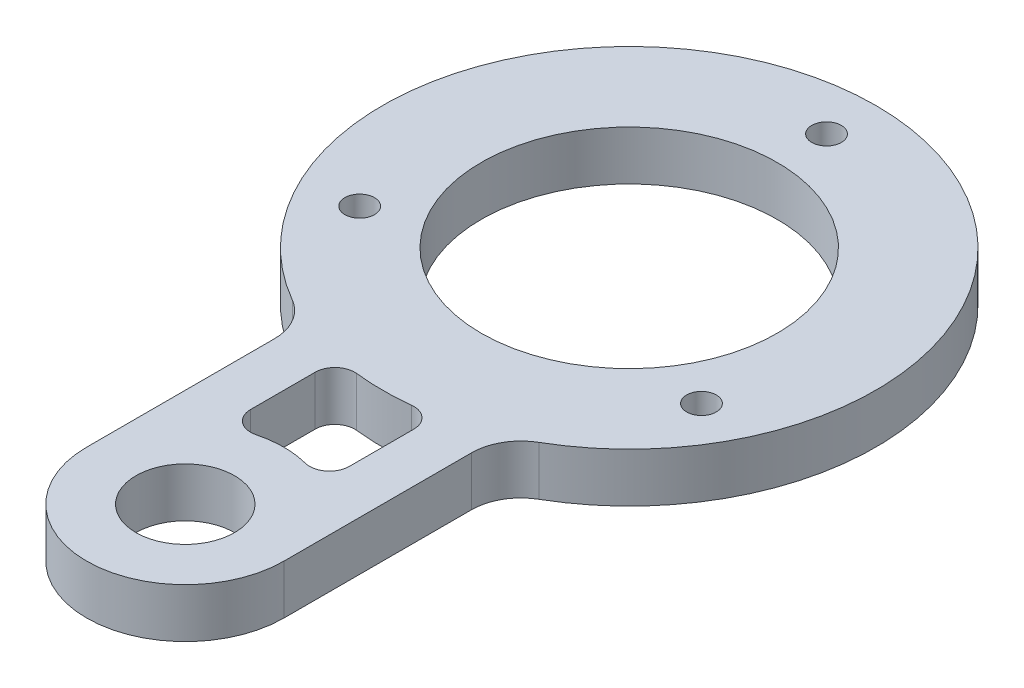
ISO-10303-21;
HEADER;
FILE_DESCRIPTION(('STEP AP214'),'2;1');
FILE_NAME('part.step','',(''),(''),'','','');
FILE_SCHEMA(('AUTOMOTIVE_DESIGN { 1 0 10303 214 1 1 1 1 }'));
ENDSEC;
DATA;
#1=APPLICATION_CONTEXT('core data for automotive mechanical design processes');
#2=APPLICATION_PROTOCOL_DEFINITION('international standard','automotive_design',2000,#1);
#3=PRODUCT_CONTEXT('',#1,'mechanical');
#4=PRODUCT('Part','Part','',(#3));
#5=PRODUCT_RELATED_PRODUCT_CATEGORY('part','',(#4));
#6=PRODUCT_DEFINITION_FORMATION('','',#4);
#7=PRODUCT_DEFINITION_CONTEXT('part definition',#1,'design');
#8=PRODUCT_DEFINITION('design','',#6,#7);
#9=PRODUCT_DEFINITION_SHAPE('','',#8);
#10=(LENGTH_UNIT() NAMED_UNIT(*) SI_UNIT(.MILLI.,.METRE.));
#11=(NAMED_UNIT(*) PLANE_ANGLE_UNIT() SI_UNIT($,.RADIAN.));
#12=(NAMED_UNIT(*) SI_UNIT($,.STERADIAN.) SOLID_ANGLE_UNIT());
#13=UNCERTAINTY_MEASURE_WITH_UNIT(LENGTH_MEASURE(1.E-05),#10,'distance_accuracy_value','');
#14=(GEOMETRIC_REPRESENTATION_CONTEXT(3) GLOBAL_UNCERTAINTY_ASSIGNED_CONTEXT((#13)) GLOBAL_UNIT_ASSIGNED_CONTEXT((#10,
#11,#12)) REPRESENTATION_CONTEXT('',''));
#15=CARTESIAN_POINT('',(0.,0.,0.));
#16=DIRECTION('',(0.,0.,1.));
#17=DIRECTION('',(1.,0.,0.));
#18=AXIS2_PLACEMENT_3D('',#15,#16,#17);
#19=CARTESIAN_POINT('',(0.,5.,-45.));
#20=DIRECTION('',(0.,1.,0.));
#21=DIRECTION('',(0.,0.,1.));
#22=AXIS2_PLACEMENT_3D('',#19,#20,#21);
#23=PLANE('',#22);
#24=CARTESIAN_POINT('',(17.3205080756888,5.,-35.));
#25=DIRECTION('',(0.,1.,0.));
#26=DIRECTION('',(0.,0.,1.));
#27=AXIS2_PLACEMENT_3D('',#24,#25,#26);
#28=CIRCLE('',#27,1.5);
#29=CARTESIAN_POINT('',(17.3205080756888,5.,-33.5));
#30=VERTEX_POINT('',#29);
#31=EDGE_CURVE('E325',#30,#30,#28,.T.);
#32=ORIENTED_EDGE('',*,*,#31,.F.);
#33=EDGE_LOOP('',(#32));
#34=FACE_BOUND('',#33,.T.);
#35=CARTESIAN_POINT('',(0.,5.,-45.));
#36=DIRECTION('',(0.,1.,0.));
#37=DIRECTION('',(0.,0.,1.));
#38=AXIS2_PLACEMENT_3D('',#35,#36,#37);
#39=CIRCLE('',#38,15.);
#40=CARTESIAN_POINT('',(0.,5.,-30.));
#41=VERTEX_POINT('',#40);
#42=EDGE_CURVE('E331',#41,#41,#39,.T.);
#43=ORIENTED_EDGE('',*,*,#42,.F.);
#44=EDGE_LOOP('',(#43));
#45=FACE_BOUND('',#44,.T.);
#46=DIRECTION('',(0.,0.,-1.));
#47=VECTOR('',#46,1.);
#48=CARTESIAN_POINT('',(10.,5.,0.));
#49=LINE('',#48,#47);
#50=CARTESIAN_POINT('',(10.,5.,0.));
#51=VERTEX_POINT('',#50);
#52=CARTESIAN_POINT('',(10.,5.,-19.0192378864668));
#53=VERTEX_POINT('',#52);
#54=EDGE_CURVE('E167',#51,#53,#49,.T.);
#55=ORIENTED_EDGE('',*,*,#54,.T.);
#56=CARTESIAN_POINT('',(15.,5.,-19.0192378864668));
#57=DIRECTION('',(0.,1.,0.));
#58=DIRECTION('',(0.,0.,1.));
#59=AXIS2_PLACEMENT_3D('',#56,#57,#58);
#60=CIRCLE('',#59,5.);
#61=CARTESIAN_POINT('',(12.5,5.,-23.349364905389));
#62=VERTEX_POINT('',#61);
#63=EDGE_CURVE('E11',#53,#62,#60,.F.);
#64=ORIENTED_EDGE('',*,*,#63,.T.);
#65=CARTESIAN_POINT('',(0.,5.,-45.));
#66=DIRECTION('',(0.,1.,0.));
#67=DIRECTION('',(0.,0.,1.));
#68=AXIS2_PLACEMENT_3D('',#65,#66,#67);
#69=CIRCLE('',#68,25.);
#70=CARTESIAN_POINT('',(-12.5,5.,-23.349364905389));
#71=VERTEX_POINT('',#70);
#72=EDGE_CURVE('E155',#62,#71,#69,.T.);
#73=ORIENTED_EDGE('',*,*,#72,.T.);
#74=CARTESIAN_POINT('',(-15.,5.,-19.0192378864668));
#75=DIRECTION('',(0.,1.,0.));
#76=DIRECTION('',(0.,0.,1.));
#77=AXIS2_PLACEMENT_3D('',#74,#75,#76);
#78=CIRCLE('',#77,5.);
#79=CARTESIAN_POINT('',(-10.,5.,-19.0192378864668));
#80=VERTEX_POINT('',#79);
#81=EDGE_CURVE('E146',#71,#80,#78,.F.);
#82=ORIENTED_EDGE('',*,*,#81,.T.);
#83=DIRECTION('',(0.,0.,1.));
#84=VECTOR('',#83,1.);
#85=CARTESIAN_POINT('',(-10.,5.,0.));
#86=LINE('',#85,#84);
#87=CARTESIAN_POINT('',(-10.,5.,0.));
#88=VERTEX_POINT('',#87);
#89=EDGE_CURVE('E140',#80,#88,#86,.T.);
#90=ORIENTED_EDGE('',*,*,#89,.T.);
#91=CARTESIAN_POINT('',(0.,5.,0.));
#92=DIRECTION('',(0.,1.,0.));
#93=DIRECTION('',(0.,0.,1.));
#94=AXIS2_PLACEMENT_3D('',#91,#92,#93);
#95=CIRCLE('',#94,10.);
#96=EDGE_CURVE('E145',#88,#51,#95,.T.);
#97=ORIENTED_EDGE('',*,*,#96,.T.);
#98=EDGE_LOOP('',(#55,#64,#73,#82,#90,#97));
#99=FACE_BOUND('',#98,.T.);
#100=CARTESIAN_POINT('',(0.,5.,0.));
#101=DIRECTION('',(0.,1.,0.));
#102=DIRECTION('',(0.,0.,1.));
#103=AXIS2_PLACEMENT_3D('',#100,#101,#102);
#104=CIRCLE('',#103,5.);
#105=CARTESIAN_POINT('',(0.,5.,5.));
#106=VERTEX_POINT('',#105);
#107=EDGE_CURVE('E174',#106,#106,#104,.T.);
#108=ORIENTED_EDGE('',*,*,#107,.F.);
#109=EDGE_LOOP('',(#108));
#110=FACE_BOUND('',#109,.T.);
#111=CARTESIAN_POINT('',(0.,5.,-65.));
#112=DIRECTION('',(0.,1.,0.));
#113=DIRECTION('',(0.,0.,1.));
#114=AXIS2_PLACEMENT_3D('',#111,#112,#113);
#115=CIRCLE('',#114,1.5);
#116=CARTESIAN_POINT('',(0.,5.,-63.5));
#117=VERTEX_POINT('',#116);
#118=EDGE_CURVE('E327',#117,#117,#115,.T.);
#119=ORIENTED_EDGE('',*,*,#118,.F.);
#120=EDGE_LOOP('',(#119));
#121=FACE_BOUND('',#120,.T.);
#122=CARTESIAN_POINT('',(-17.3205080756888,5.,-35.));
#123=DIRECTION('',(0.,1.,0.));
#124=DIRECTION('',(0.,0.,1.));
#125=AXIS2_PLACEMENT_3D('',#122,#123,#124);
#126=CIRCLE('',#125,1.5);
#127=CARTESIAN_POINT('',(-17.3205080756888,5.,-33.5));
#128=VERTEX_POINT('',#127);
#129=EDGE_CURVE('E316',#128,#128,#126,.T.);
#130=ORIENTED_EDGE('',*,*,#129,.F.);
#131=EDGE_LOOP('',(#130));
#132=FACE_BOUND('',#131,.T.);
#133=DIRECTION('',(0.,0.,-1.));
#134=VECTOR('',#133,1.);
#135=CARTESIAN_POINT('',(5.00000000000001,5.,0.));
#136=LINE('',#135,#134);
#137=CARTESIAN_POINT('',(5.00000000000001,5.,-11.6189500386223));
#138=VERTEX_POINT('',#137);
#139=CARTESIAN_POINT('',(5.,5.,-18.1671842700025));
#140=VERTEX_POINT('',#139);
#141=EDGE_CURVE('E310',#138,#140,#136,.T.);
#142=ORIENTED_EDGE('',*,*,#141,.F.);
#143=CARTESIAN_POINT('',(3.,5.,-11.6189500386223));
#144=DIRECTION('',(0.,1.,0.));
#145=DIRECTION('',(0.,0.,1.));
#146=AXIS2_PLACEMENT_3D('',#143,#144,#145);
#147=CIRCLE('',#146,2.);
#148=CARTESIAN_POINT('',(2.5,5.,-9.68245836551854));
#149=VERTEX_POINT('',#148);
#150=EDGE_CURVE('E208',#138,#149,#147,.F.);
#151=ORIENTED_EDGE('',*,*,#150,.T.);
#152=CARTESIAN_POINT('',(0.,5.,0.));
#153=DIRECTION('',(0.,1.,0.));
#154=DIRECTION('',(0.,0.,1.));
#155=AXIS2_PLACEMENT_3D('',#152,#153,#154);
#156=CIRCLE('',#155,10.);
#157=CARTESIAN_POINT('',(-2.5,5.,-9.68245836551854));
#158=VERTEX_POINT('',#157);
#159=EDGE_CURVE('E308',#149,#158,#156,.T.);
#160=ORIENTED_EDGE('',*,*,#159,.T.);
#161=CARTESIAN_POINT('',(-3.,5.,-11.6189500386223));
#162=DIRECTION('',(0.,1.,0.));
#163=DIRECTION('',(0.,0.,1.));
#164=AXIS2_PLACEMENT_3D('',#161,#162,#163);
#165=CIRCLE('',#164,2.);
#166=CARTESIAN_POINT('',(-5.00000000000001,5.,-11.6189500386223));
#167=VERTEX_POINT('',#166);
#168=EDGE_CURVE('E215',#158,#167,#165,.F.);
#169=ORIENTED_EDGE('',*,*,#168,.T.);
#170=DIRECTION('',(0.,0.,1.));
#171=VECTOR('',#170,1.);
#172=CARTESIAN_POINT('',(-5.00000000000001,5.,0.));
#173=LINE('',#172,#171);
#174=CARTESIAN_POINT('',(-5.,5.,-18.1671842700025));
#175=VERTEX_POINT('',#174);
#176=EDGE_CURVE('E296',#175,#167,#173,.T.);
#177=ORIENTED_EDGE('',*,*,#176,.F.);
#178=CARTESIAN_POINT('',(-3.,5.,-18.1671842700025));
#179=DIRECTION('',(0.,1.,0.));
#180=DIRECTION('',(0.,0.,1.));
#181=AXIS2_PLACEMENT_3D('',#178,#179,#180);
#182=CIRCLE('',#181,2.);
#183=CARTESIAN_POINT('',(-2.77777777777778,5.,-20.1548002500023));
#184=VERTEX_POINT('',#183);
#185=EDGE_CURVE('E199',#175,#184,#182,.F.);
#186=ORIENTED_EDGE('',*,*,#185,.T.);
#187=CARTESIAN_POINT('',(0.,5.,-45.));
#188=DIRECTION('',(0.,1.,0.));
#189=DIRECTION('',(0.,0.,1.));
#190=AXIS2_PLACEMENT_3D('',#187,#188,#189);
#191=CIRCLE('',#190,25.);
#192=CARTESIAN_POINT('',(2.77777777777778,5.,-20.1548002500023));
#193=VERTEX_POINT('',#192);
#194=EDGE_CURVE('E313',#184,#193,#191,.T.);
#195=ORIENTED_EDGE('',*,*,#194,.T.);
#196=CARTESIAN_POINT('',(3.,5.,-18.1671842700025));
#197=DIRECTION('',(0.,1.,0.));
#198=DIRECTION('',(0.,0.,1.));
#199=AXIS2_PLACEMENT_3D('',#196,#197,#198);
#200=CIRCLE('',#199,2.);
#201=EDGE_CURVE('E204',#193,#140,#200,.F.);
#202=ORIENTED_EDGE('',*,*,#201,.T.);
#203=EDGE_LOOP('',(#142,#151,#160,#169,#177,#186,#195,#202));
#204=FACE_BOUND('',#203,.T.);
#205=ADVANCED_FACE('F37',(#34,#45,#99,#110,#121,#132,#204),#23,.T.);
#206=CARTESIAN_POINT('',(0.,0.,-45.));
#207=DIRECTION('',(0.,1.,0.));
#208=DIRECTION('',(0.,0.,1.));
#209=AXIS2_PLACEMENT_3D('',#206,#207,#208);
#210=PLANE('',#209);
#211=CARTESIAN_POINT('',(-17.3205080756888,0.,-35.));
#212=DIRECTION('',(0.,1.,0.));
#213=DIRECTION('',(0.,0.,1.));
#214=AXIS2_PLACEMENT_3D('',#211,#212,#213);
#215=CIRCLE('',#214,1.5);
#216=CARTESIAN_POINT('',(-17.3205080756888,0.,-33.5));
#217=VERTEX_POINT('',#216);
#218=EDGE_CURVE('E305',#217,#217,#215,.T.);
#219=ORIENTED_EDGE('',*,*,#218,.T.);
#220=EDGE_LOOP('',(#219));
#221=FACE_BOUND('',#220,.T.);
#222=CARTESIAN_POINT('',(17.3205080756888,0.,-35.));
#223=DIRECTION('',(0.,1.,0.));
#224=DIRECTION('',(0.,0.,1.));
#225=AXIS2_PLACEMENT_3D('',#222,#223,#224);
#226=CIRCLE('',#225,1.5);
#227=CARTESIAN_POINT('',(17.3205080756888,0.,-33.5));
#228=VERTEX_POINT('',#227);
#229=EDGE_CURVE('E317',#228,#228,#226,.T.);
#230=ORIENTED_EDGE('',*,*,#229,.T.);
#231=EDGE_LOOP('',(#230));
#232=FACE_BOUND('',#231,.T.);
#233=CARTESIAN_POINT('',(0.,0.,-65.));
#234=DIRECTION('',(0.,1.,0.));
#235=DIRECTION('',(0.,0.,1.));
#236=AXIS2_PLACEMENT_3D('',#233,#234,#235);
#237=CIRCLE('',#236,1.5);
#238=CARTESIAN_POINT('',(0.,0.,-63.5));
#239=VERTEX_POINT('',#238);
#240=EDGE_CURVE('E324',#239,#239,#237,.T.);
#241=ORIENTED_EDGE('',*,*,#240,.T.);
#242=EDGE_LOOP('',(#241));
#243=FACE_BOUND('',#242,.T.);
#244=CARTESIAN_POINT('',(0.,0.,-45.));
#245=DIRECTION('',(0.,1.,0.));
#246=DIRECTION('',(0.,0.,1.));
#247=AXIS2_PLACEMENT_3D('',#244,#245,#246);
#248=CIRCLE('',#247,15.);
#249=CARTESIAN_POINT('',(0.,0.,-30.));
#250=VERTEX_POINT('',#249);
#251=EDGE_CURVE('E332',#250,#250,#248,.T.);
#252=ORIENTED_EDGE('',*,*,#251,.T.);
#253=EDGE_LOOP('',(#252));
#254=FACE_BOUND('',#253,.T.);
#255=CARTESIAN_POINT('',(0.,0.,0.));
#256=DIRECTION('',(0.,1.,0.));
#257=DIRECTION('',(0.,0.,1.));
#258=AXIS2_PLACEMENT_3D('',#255,#256,#257);
#259=CIRCLE('',#258,5.);
#260=CARTESIAN_POINT('',(0.,0.,5.));
#261=VERTEX_POINT('',#260);
#262=EDGE_CURVE('E340',#261,#261,#259,.T.);
#263=ORIENTED_EDGE('',*,*,#262,.T.);
#264=EDGE_LOOP('',(#263));
#265=FACE_BOUND('',#264,.T.);
#266=CARTESIAN_POINT('',(0.,0.,-45.));
#267=DIRECTION('',(0.,1.,0.));
#268=DIRECTION('',(0.,0.,1.));
#269=AXIS2_PLACEMENT_3D('',#266,#267,#268);
#270=CIRCLE('',#269,25.);
#271=CARTESIAN_POINT('',(12.5,0.,-23.349364905389));
#272=VERTEX_POINT('',#271);
#273=CARTESIAN_POINT('',(-12.5,0.,-23.349364905389));
#274=VERTEX_POINT('',#273);
#275=EDGE_CURVE('E172',#272,#274,#270,.T.);
#276=ORIENTED_EDGE('',*,*,#275,.F.);
#277=CARTESIAN_POINT('',(15.,0.,-19.0192378864668));
#278=DIRECTION('',(0.,1.,0.));
#279=DIRECTION('',(0.,0.,1.));
#280=AXIS2_PLACEMENT_3D('',#277,#278,#279);
#281=CIRCLE('',#280,5.);
#282=CARTESIAN_POINT('',(10.,0.,-19.0192378864668));
#283=VERTEX_POINT('',#282);
#284=EDGE_CURVE('E48',#272,#283,#281,.T.);
#285=ORIENTED_EDGE('',*,*,#284,.T.);
#286=DIRECTION('',(0.,0.,-1.));
#287=VECTOR('',#286,1.);
#288=CARTESIAN_POINT('',(10.,0.,0.));
#289=LINE('',#288,#287);
#290=CARTESIAN_POINT('',(10.,0.,0.));
#291=VERTEX_POINT('',#290);
#292=EDGE_CURVE('E179',#291,#283,#289,.T.);
#293=ORIENTED_EDGE('',*,*,#292,.F.);
#294=CARTESIAN_POINT('',(0.,0.,0.));
#295=DIRECTION('',(0.,1.,0.));
#296=DIRECTION('',(0.,0.,1.));
#297=AXIS2_PLACEMENT_3D('',#294,#295,#296);
#298=CIRCLE('',#297,10.);
#299=CARTESIAN_POINT('',(-10.,0.,0.));
#300=VERTEX_POINT('',#299);
#301=EDGE_CURVE('E176',#300,#291,#298,.T.);
#302=ORIENTED_EDGE('',*,*,#301,.F.);
#303=DIRECTION('',(0.,0.,1.));
#304=VECTOR('',#303,1.);
#305=CARTESIAN_POINT('',(-10.,0.,0.));
#306=LINE('',#305,#304);
#307=CARTESIAN_POINT('',(-10.,0.,-19.0192378864668));
#308=VERTEX_POINT('',#307);
#309=EDGE_CURVE('E158',#308,#300,#306,.T.);
#310=ORIENTED_EDGE('',*,*,#309,.F.);
#311=CARTESIAN_POINT('',(-15.,0.,-19.0192378864668));
#312=DIRECTION('',(0.,1.,0.));
#313=DIRECTION('',(0.,0.,1.));
#314=AXIS2_PLACEMENT_3D('',#311,#312,#313);
#315=CIRCLE('',#314,5.);
#316=EDGE_CURVE('E221',#308,#274,#315,.T.);
#317=ORIENTED_EDGE('',*,*,#316,.T.);
#318=EDGE_LOOP('',(#276,#285,#293,#302,#310,#317));
#319=FACE_BOUND('',#318,.T.);
#320=CARTESIAN_POINT('',(0.,0.,0.));
#321=DIRECTION('',(0.,1.,0.));
#322=DIRECTION('',(0.,0.,1.));
#323=AXIS2_PLACEMENT_3D('',#320,#321,#322);
#324=CIRCLE('',#323,10.);
#325=CARTESIAN_POINT('',(2.5,0.,-9.68245836551854));
#326=VERTEX_POINT('',#325);
#327=CARTESIAN_POINT('',(-2.5,0.,-9.68245836551854));
#328=VERTEX_POINT('',#327);
#329=EDGE_CURVE('E290',#326,#328,#324,.T.);
#330=ORIENTED_EDGE('',*,*,#329,.F.);
#331=CARTESIAN_POINT('',(3.,0.,-11.6189500386223));
#332=DIRECTION('',(0.,1.,0.));
#333=DIRECTION('',(0.,0.,1.));
#334=AXIS2_PLACEMENT_3D('',#331,#332,#333);
#335=CIRCLE('',#334,2.);
#336=CARTESIAN_POINT('',(5.00000000000001,0.,-11.6189500386223));
#337=VERTEX_POINT('',#336);
#338=EDGE_CURVE('E209',#326,#337,#335,.T.);
#339=ORIENTED_EDGE('',*,*,#338,.T.);
#340=DIRECTION('',(0.,0.,-1.));
#341=VECTOR('',#340,1.);
#342=CARTESIAN_POINT('',(5.00000000000001,0.,0.));
#343=LINE('',#342,#341);
#344=CARTESIAN_POINT('',(5.,0.,-18.1671842700025));
#345=VERTEX_POINT('',#344);
#346=EDGE_CURVE('E287',#337,#345,#343,.T.);
#347=ORIENTED_EDGE('',*,*,#346,.T.);
#348=CARTESIAN_POINT('',(3.,0.,-18.1671842700025));
#349=DIRECTION('',(0.,1.,0.));
#350=DIRECTION('',(0.,0.,1.));
#351=AXIS2_PLACEMENT_3D('',#348,#349,#350);
#352=CIRCLE('',#351,2.);
#353=CARTESIAN_POINT('',(2.77777777777778,0.,-20.1548002500023));
#354=VERTEX_POINT('',#353);
#355=EDGE_CURVE('E206',#345,#354,#352,.T.);
#356=ORIENTED_EDGE('',*,*,#355,.T.);
#357=CARTESIAN_POINT('',(0.,0.,-45.));
#358=DIRECTION('',(0.,1.,0.));
#359=DIRECTION('',(0.,0.,1.));
#360=AXIS2_PLACEMENT_3D('',#357,#358,#359);
#361=CIRCLE('',#360,25.);
#362=CARTESIAN_POINT('',(-2.77777777777778,0.,-20.1548002500023));
#363=VERTEX_POINT('',#362);
#364=EDGE_CURVE('E293',#363,#354,#361,.T.);
#365=ORIENTED_EDGE('',*,*,#364,.F.);
#366=CARTESIAN_POINT('',(-3.,0.,-18.1671842700025));
#367=DIRECTION('',(0.,1.,0.));
#368=DIRECTION('',(0.,0.,1.));
#369=AXIS2_PLACEMENT_3D('',#366,#367,#368);
#370=CIRCLE('',#369,2.);
#371=CARTESIAN_POINT('',(-5.,0.,-18.1671842700025));
#372=VERTEX_POINT('',#371);
#373=EDGE_CURVE('E205',#363,#372,#370,.T.);
#374=ORIENTED_EDGE('',*,*,#373,.T.);
#375=DIRECTION('',(0.,0.,1.));
#376=VECTOR('',#375,1.);
#377=CARTESIAN_POINT('',(-5.00000000000001,0.,0.));
#378=LINE('',#377,#376);
#379=CARTESIAN_POINT('',(-5.00000000000001,0.,-11.6189500386223));
#380=VERTEX_POINT('',#379);
#381=EDGE_CURVE('E298',#372,#380,#378,.T.);
#382=ORIENTED_EDGE('',*,*,#381,.T.);
#383=CARTESIAN_POINT('',(-3.,0.,-11.6189500386223));
#384=DIRECTION('',(0.,1.,0.));
#385=DIRECTION('',(0.,0.,1.));
#386=AXIS2_PLACEMENT_3D('',#383,#384,#385);
#387=CIRCLE('',#386,2.);
#388=EDGE_CURVE('E212',#380,#328,#387,.T.);
#389=ORIENTED_EDGE('',*,*,#388,.T.);
#390=EDGE_LOOP('',(#330,#339,#347,#356,#365,#374,#382,#389));
#391=FACE_BOUND('',#390,.T.);
#392=ADVANCED_FACE('F227',(#221,#232,#243,#254,#265,#319,#391),#210,.F.);
#393=CARTESIAN_POINT('',(0.,5.,-45.));
#394=DIRECTION('',(0.,-1.,0.));
#395=DIRECTION('',(0.,0.,-1.));
#396=AXIS2_PLACEMENT_3D('',#393,#394,#395);
#397=CYLINDRICAL_SURFACE('',#396,25.);
#398=ORIENTED_EDGE('',*,*,#275,.T.);
#399=DIRECTION('',(0.,-1.,0.));
#400=VECTOR('',#399,1.);
#401=CARTESIAN_POINT('',(-12.5,5.,-23.349364905389));
#402=LINE('',#401,#400);
#403=EDGE_CURVE('E222',#274,#71,#402,.F.);
#404=ORIENTED_EDGE('',*,*,#403,.T.);
#405=ORIENTED_EDGE('',*,*,#72,.F.);
#406=DIRECTION('',(0.,-1.,0.));
#407=VECTOR('',#406,1.);
#408=CARTESIAN_POINT('',(12.5,5.,-23.349364905389));
#409=LINE('',#408,#407);
#410=EDGE_CURVE('E217',#62,#272,#409,.T.);
#411=ORIENTED_EDGE('',*,*,#410,.T.);
#412=EDGE_LOOP('',(#398,#404,#405,#411));
#413=FACE_BOUND('',#412,.T.);
#414=ADVANCED_FACE('F231',(#413),#397,.T.);
#415=CARTESIAN_POINT('',(-10.,5.,0.));
#416=DIRECTION('',(1.,0.,0.));
#417=DIRECTION('',(0.,0.,-1.));
#418=AXIS2_PLACEMENT_3D('',#415,#416,#417);
#419=PLANE('',#418);
#420=ORIENTED_EDGE('',*,*,#89,.F.);
#421=DIRECTION('',(0.,1.,0.));
#422=VECTOR('',#421,1.);
#423=CARTESIAN_POINT('',(-10.,0.,-19.0192378864668));
#424=LINE('',#423,#422);
#425=EDGE_CURVE('E216',#80,#308,#424,.F.);
#426=ORIENTED_EDGE('',*,*,#425,.T.);
#427=ORIENTED_EDGE('',*,*,#309,.T.);
#428=DIRECTION('',(0.,-1.,0.));
#429=VECTOR('',#428,1.);
#430=CARTESIAN_POINT('',(-10.,5.,0.));
#431=LINE('',#430,#429);
#432=EDGE_CURVE('E154',#88,#300,#431,.T.);
#433=ORIENTED_EDGE('',*,*,#432,.F.);
#434=EDGE_LOOP('',(#420,#426,#427,#433));
#435=FACE_BOUND('',#434,.T.);
#436=ADVANCED_FACE('F156',(#435),#419,.F.);
#437=CARTESIAN_POINT('',(0.,5.,0.));
#438=DIRECTION('',(0.,-1.,0.));
#439=DIRECTION('',(0.,0.,-1.));
#440=AXIS2_PLACEMENT_3D('',#437,#438,#439);
#441=CYLINDRICAL_SURFACE('',#440,10.);
#442=ORIENTED_EDGE('',*,*,#301,.T.);
#443=DIRECTION('',(0.,-1.,0.));
#444=VECTOR('',#443,1.);
#445=CARTESIAN_POINT('',(10.,5.,0.));
#446=LINE('',#445,#444);
#447=EDGE_CURVE('E165',#51,#291,#446,.T.);
#448=ORIENTED_EDGE('',*,*,#447,.F.);
#449=ORIENTED_EDGE('',*,*,#96,.F.);
#450=ORIENTED_EDGE('',*,*,#432,.T.);
#451=EDGE_LOOP('',(#442,#448,#449,#450));
#452=FACE_BOUND('',#451,.T.);
#453=ADVANCED_FACE('F163',(#452),#441,.T.);
#454=CARTESIAN_POINT('',(10.,5.,0.));
#455=DIRECTION('',(-1.,0.,0.));
#456=DIRECTION('',(0.,0.,1.));
#457=AXIS2_PLACEMENT_3D('',#454,#455,#456);
#458=PLANE('',#457);
#459=ORIENTED_EDGE('',*,*,#292,.T.);
#460=DIRECTION('',(0.,1.,0.));
#461=VECTOR('',#460,1.);
#462=CARTESIAN_POINT('',(10.,5.,-19.0192378864668));
#463=LINE('',#462,#461);
#464=EDGE_CURVE('E54',#283,#53,#463,.T.);
#465=ORIENTED_EDGE('',*,*,#464,.T.);
#466=ORIENTED_EDGE('',*,*,#54,.F.);
#467=ORIENTED_EDGE('',*,*,#447,.T.);
#468=EDGE_LOOP('',(#459,#465,#466,#467));
#469=FACE_BOUND('',#468,.T.);
#470=ADVANCED_FACE('F257',(#469),#458,.F.);
#471=CARTESIAN_POINT('',(0.,5.,0.));
#472=DIRECTION('',(0.,-1.,0.));
#473=DIRECTION('',(0.,0.,-1.));
#474=AXIS2_PLACEMENT_3D('',#471,#472,#473);
#475=CYLINDRICAL_SURFACE('',#474,5.);
#476=ORIENTED_EDGE('',*,*,#107,.T.);
#477=EDGE_LOOP('',(#476));
#478=FACE_BOUND('',#477,.T.);
#479=ORIENTED_EDGE('',*,*,#262,.F.);
#480=EDGE_LOOP('',(#479));
#481=FACE_BOUND('',#480,.T.);
#482=ADVANCED_FACE('F260',(#478,#481),#475,.F.);
#483=CARTESIAN_POINT('',(0.,5.,-45.));
#484=DIRECTION('',(0.,-1.,0.));
#485=DIRECTION('',(0.,0.,-1.));
#486=AXIS2_PLACEMENT_3D('',#483,#484,#485);
#487=CYLINDRICAL_SURFACE('',#486,15.);
#488=ORIENTED_EDGE('',*,*,#42,.T.);
#489=EDGE_LOOP('',(#488));
#490=FACE_BOUND('',#489,.T.);
#491=ORIENTED_EDGE('',*,*,#251,.F.);
#492=EDGE_LOOP('',(#491));
#493=FACE_BOUND('',#492,.T.);
#494=ADVANCED_FACE('F346',(#490,#493),#487,.F.);
#495=CARTESIAN_POINT('',(0.,5.,-65.));
#496=DIRECTION('',(0.,-1.,0.));
#497=DIRECTION('',(0.,0.,-1.));
#498=AXIS2_PLACEMENT_3D('',#495,#496,#497);
#499=CYLINDRICAL_SURFACE('',#498,1.5);
#500=ORIENTED_EDGE('',*,*,#118,.T.);
#501=EDGE_LOOP('',(#500));
#502=FACE_BOUND('',#501,.T.);
#503=ORIENTED_EDGE('',*,*,#240,.F.);
#504=EDGE_LOOP('',(#503));
#505=FACE_BOUND('',#504,.T.);
#506=ADVANCED_FACE('F353',(#502,#505),#499,.F.);
#507=CARTESIAN_POINT('',(17.3205080756888,5.,-35.));
#508=DIRECTION('',(0.,-1.,0.));
#509=DIRECTION('',(0.,0.,-1.));
#510=AXIS2_PLACEMENT_3D('',#507,#508,#509);
#511=CYLINDRICAL_SURFACE('',#510,1.5);
#512=ORIENTED_EDGE('',*,*,#31,.T.);
#513=EDGE_LOOP('',(#512));
#514=FACE_BOUND('',#513,.T.);
#515=ORIENTED_EDGE('',*,*,#229,.F.);
#516=EDGE_LOOP('',(#515));
#517=FACE_BOUND('',#516,.T.);
#518=ADVANCED_FACE('F390',(#514,#517),#511,.F.);
#519=CARTESIAN_POINT('',(-17.3205080756888,5.,-35.));
#520=DIRECTION('',(0.,-1.,0.));
#521=DIRECTION('',(0.,0.,-1.));
#522=AXIS2_PLACEMENT_3D('',#519,#520,#521);
#523=CYLINDRICAL_SURFACE('',#522,1.5);
#524=ORIENTED_EDGE('',*,*,#129,.T.);
#525=EDGE_LOOP('',(#524));
#526=FACE_BOUND('',#525,.T.);
#527=ORIENTED_EDGE('',*,*,#218,.F.);
#528=EDGE_LOOP('',(#527));
#529=FACE_BOUND('',#528,.T.);
#530=ADVANCED_FACE('F379',(#526,#529),#523,.F.);
#531=CARTESIAN_POINT('',(0.,0.,0.));
#532=DIRECTION('',(0.,1.,0.));
#533=DIRECTION('',(0.,0.,1.));
#534=AXIS2_PLACEMENT_3D('',#531,#532,#533);
#535=CYLINDRICAL_SURFACE('',#534,10.);
#536=ORIENTED_EDGE('',*,*,#159,.F.);
#537=DIRECTION('',(0.,1.,0.));
#538=VECTOR('',#537,1.);
#539=CARTESIAN_POINT('',(2.5,0.,-9.68245836551854));
#540=LINE('',#539,#538);
#541=EDGE_CURVE('E196',#149,#326,#540,.F.);
#542=ORIENTED_EDGE('',*,*,#541,.T.);
#543=ORIENTED_EDGE('',*,*,#329,.T.);
#544=DIRECTION('',(0.,1.,0.));
#545=VECTOR('',#544,1.);
#546=CARTESIAN_POINT('',(-2.5,0.,-9.68245836551854));
#547=LINE('',#546,#545);
#548=EDGE_CURVE('E195',#328,#158,#547,.T.);
#549=ORIENTED_EDGE('',*,*,#548,.T.);
#550=EDGE_LOOP('',(#536,#542,#543,#549));
#551=FACE_BOUND('',#550,.T.);
#552=ADVANCED_FACE('F378',(#551),#535,.T.);
#553=CARTESIAN_POINT('',(-5.00000000000001,0.,0.));
#554=DIRECTION('',(-1.,0.,0.));
#555=DIRECTION('',(0.,0.,1.));
#556=AXIS2_PLACEMENT_3D('',#553,#554,#555);
#557=PLANE('',#556);
#558=ORIENTED_EDGE('',*,*,#381,.F.);
#559=DIRECTION('',(0.,1.,0.));
#560=VECTOR('',#559,1.);
#561=CARTESIAN_POINT('',(-5.,0.,-18.1671842700025));
#562=LINE('',#561,#560);
#563=EDGE_CURVE('E185',#372,#175,#562,.T.);
#564=ORIENTED_EDGE('',*,*,#563,.T.);
#565=ORIENTED_EDGE('',*,*,#176,.T.);
#566=DIRECTION('',(0.,1.,0.));
#567=VECTOR('',#566,1.);
#568=CARTESIAN_POINT('',(-5.00000000000001,0.,-11.6189500386223));
#569=LINE('',#568,#567);
#570=EDGE_CURVE('E161',#167,#380,#569,.F.);
#571=ORIENTED_EDGE('',*,*,#570,.T.);
#572=EDGE_LOOP('',(#558,#564,#565,#571));
#573=FACE_BOUND('',#572,.T.);
#574=ADVANCED_FACE('F373',(#573),#557,.F.);
#575=CARTESIAN_POINT('',(0.,0.,-45.));
#576=DIRECTION('',(0.,1.,0.));
#577=DIRECTION('',(0.,0.,1.));
#578=AXIS2_PLACEMENT_3D('',#575,#576,#577);
#579=CYLINDRICAL_SURFACE('',#578,25.);
#580=ORIENTED_EDGE('',*,*,#194,.F.);
#581=DIRECTION('',(0.,1.,0.));
#582=VECTOR('',#581,1.);
#583=CARTESIAN_POINT('',(-2.77777777777778,0.,-20.1548002500023));
#584=LINE('',#583,#582);
#585=EDGE_CURVE('E188',#184,#363,#584,.F.);
#586=ORIENTED_EDGE('',*,*,#585,.T.);
#587=ORIENTED_EDGE('',*,*,#364,.T.);
#588=DIRECTION('',(0.,1.,0.));
#589=VECTOR('',#588,1.);
#590=CARTESIAN_POINT('',(2.77777777777778,0.,-20.1548002500023));
#591=LINE('',#590,#589);
#592=EDGE_CURVE('E183',#354,#193,#591,.T.);
#593=ORIENTED_EDGE('',*,*,#592,.T.);
#594=EDGE_LOOP('',(#580,#586,#587,#593));
#595=FACE_BOUND('',#594,.T.);
#596=ADVANCED_FACE('F370',(#595),#579,.T.);
#597=CARTESIAN_POINT('',(5.00000000000001,0.,0.));
#598=DIRECTION('',(1.,0.,0.));
#599=DIRECTION('',(0.,0.,-1.));
#600=AXIS2_PLACEMENT_3D('',#597,#598,#599);
#601=PLANE('',#600);
#602=ORIENTED_EDGE('',*,*,#141,.T.);
#603=DIRECTION('',(0.,1.,0.));
#604=VECTOR('',#603,1.);
#605=CARTESIAN_POINT('',(5.,0.,-18.1671842700025));
#606=LINE('',#605,#604);
#607=EDGE_CURVE('E194',#140,#345,#606,.F.);
#608=ORIENTED_EDGE('',*,*,#607,.T.);
#609=ORIENTED_EDGE('',*,*,#346,.F.);
#610=DIRECTION('',(0.,1.,0.));
#611=VECTOR('',#610,1.);
#612=CARTESIAN_POINT('',(5.00000000000001,0.,-11.6189500386223));
#613=LINE('',#612,#611);
#614=EDGE_CURVE('E186',#337,#138,#613,.T.);
#615=ORIENTED_EDGE('',*,*,#614,.T.);
#616=EDGE_LOOP('',(#602,#608,#609,#615));
#617=FACE_BOUND('',#616,.T.);
#618=ADVANCED_FACE('F275',(#617),#601,.F.);
#619=CARTESIAN_POINT('',(-3.,0.,-18.1671842700025));
#620=DIRECTION('',(0.,1.,0.));
#621=DIRECTION('',(0.,0.,1.));
#622=AXIS2_PLACEMENT_3D('',#619,#620,#621);
#623=CYLINDRICAL_SURFACE('',#622,2.);
#624=ORIENTED_EDGE('',*,*,#373,.F.);
#625=ORIENTED_EDGE('',*,*,#585,.F.);
#626=ORIENTED_EDGE('',*,*,#185,.F.);
#627=ORIENTED_EDGE('',*,*,#563,.F.);
#628=EDGE_LOOP('',(#624,#625,#626,#627));
#629=FACE_BOUND('',#628,.T.);
#630=ADVANCED_FACE('F268',(#629),#623,.F.);
#631=CARTESIAN_POINT('',(3.,0.,-18.1671842700025));
#632=DIRECTION('',(0.,1.,0.));
#633=DIRECTION('',(0.,0.,1.));
#634=AXIS2_PLACEMENT_3D('',#631,#632,#633);
#635=CYLINDRICAL_SURFACE('',#634,2.);
#636=ORIENTED_EDGE('',*,*,#355,.F.);
#637=ORIENTED_EDGE('',*,*,#607,.F.);
#638=ORIENTED_EDGE('',*,*,#201,.F.);
#639=ORIENTED_EDGE('',*,*,#592,.F.);
#640=EDGE_LOOP('',(#636,#637,#638,#639));
#641=FACE_BOUND('',#640,.T.);
#642=ADVANCED_FACE('F271',(#641),#635,.F.);
#643=CARTESIAN_POINT('',(3.,0.,-11.6189500386223));
#644=DIRECTION('',(0.,1.,0.));
#645=DIRECTION('',(0.,0.,1.));
#646=AXIS2_PLACEMENT_3D('',#643,#644,#645);
#647=CYLINDRICAL_SURFACE('',#646,2.);
#648=ORIENTED_EDGE('',*,*,#338,.F.);
#649=ORIENTED_EDGE('',*,*,#541,.F.);
#650=ORIENTED_EDGE('',*,*,#150,.F.);
#651=ORIENTED_EDGE('',*,*,#614,.F.);
#652=EDGE_LOOP('',(#648,#649,#650,#651));
#653=FACE_BOUND('',#652,.T.);
#654=ADVANCED_FACE('F243',(#653),#647,.F.);
#655=CARTESIAN_POINT('',(-3.,0.,-11.6189500386223));
#656=DIRECTION('',(0.,1.,0.));
#657=DIRECTION('',(0.,0.,1.));
#658=AXIS2_PLACEMENT_3D('',#655,#656,#657);
#659=CYLINDRICAL_SURFACE('',#658,2.);
#660=ORIENTED_EDGE('',*,*,#388,.F.);
#661=ORIENTED_EDGE('',*,*,#570,.F.);
#662=ORIENTED_EDGE('',*,*,#168,.F.);
#663=ORIENTED_EDGE('',*,*,#548,.F.);
#664=EDGE_LOOP('',(#660,#661,#662,#663));
#665=FACE_BOUND('',#664,.T.);
#666=ADVANCED_FACE('F237',(#665),#659,.F.);
#667=CARTESIAN_POINT('',(-15.,5.,-19.0192378864668));
#668=DIRECTION('',(0.,-1.,0.));
#669=DIRECTION('',(0.,0.,-1.));
#670=AXIS2_PLACEMENT_3D('',#667,#668,#669);
#671=CYLINDRICAL_SURFACE('',#670,5.);
#672=ORIENTED_EDGE('',*,*,#81,.F.);
#673=ORIENTED_EDGE('',*,*,#403,.F.);
#674=ORIENTED_EDGE('',*,*,#316,.F.);
#675=ORIENTED_EDGE('',*,*,#425,.F.);
#676=EDGE_LOOP('',(#672,#673,#674,#675));
#677=FACE_BOUND('',#676,.T.);
#678=ADVANCED_FACE('F233',(#677),#671,.F.);
#679=CARTESIAN_POINT('',(15.,5.,-19.0192378864668));
#680=DIRECTION('',(0.,-1.,0.));
#681=DIRECTION('',(0.,0.,-1.));
#682=AXIS2_PLACEMENT_3D('',#679,#680,#681);
#683=CYLINDRICAL_SURFACE('',#682,5.);
#684=ORIENTED_EDGE('',*,*,#63,.F.);
#685=ORIENTED_EDGE('',*,*,#464,.F.);
#686=ORIENTED_EDGE('',*,*,#284,.F.);
#687=ORIENTED_EDGE('',*,*,#410,.F.);
#688=EDGE_LOOP('',(#684,#685,#686,#687));
#689=FACE_BOUND('',#688,.T.);
#690=ADVANCED_FACE('F45',(#689),#683,.F.);
#691=CLOSED_SHELL('',(#205,#392,#414,#436,#453,#470,#482,#494,#506,#518,#530,#552,#574,#596,
#618,#630,#642,#654,#666,#678,#690));
#692=MANIFOLD_SOLID_BREP('B2',#691);
#693=ADVANCED_BREP_SHAPE_REPRESENTATION('',(#18,#692),#14);
#694=SHAPE_DEFINITION_REPRESENTATION(#9,#693);
ENDSEC;
END-ISO-10303-21;
